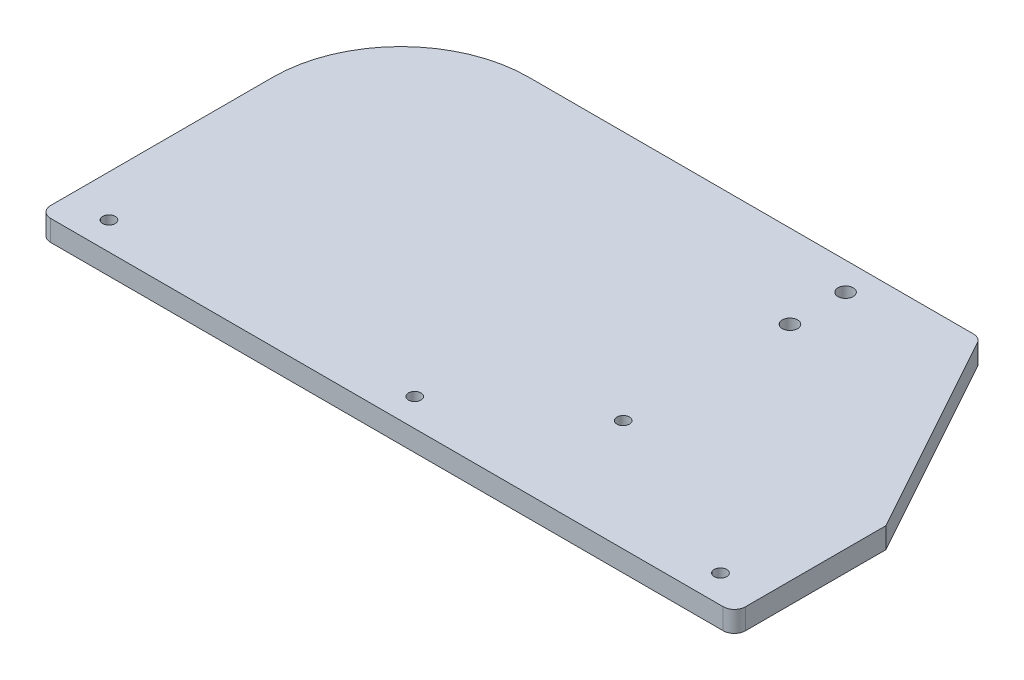
ISO-10303-21;
HEADER;
FILE_DESCRIPTION(('STEP AP214'),'2;1');
FILE_NAME('part.step','',(''),(''),'','','');
FILE_SCHEMA(('AUTOMOTIVE_DESIGN { 1 0 10303 214 1 1 1 1 }'));
ENDSEC;
DATA;
#1=APPLICATION_CONTEXT('core data for automotive mechanical design processes');
#2=APPLICATION_PROTOCOL_DEFINITION('international standard','automotive_design',2000,#1);
#3=PRODUCT_CONTEXT('',#1,'mechanical');
#4=PRODUCT('Part','Part','',(#3));
#5=PRODUCT_RELATED_PRODUCT_CATEGORY('part','',(#4));
#6=PRODUCT_DEFINITION_FORMATION('','',#4);
#7=PRODUCT_DEFINITION_CONTEXT('part definition',#1,'design');
#8=PRODUCT_DEFINITION('design','',#6,#7);
#9=PRODUCT_DEFINITION_SHAPE('','',#8);
#10=(LENGTH_UNIT() NAMED_UNIT(*) SI_UNIT(.MILLI.,.METRE.));
#11=(NAMED_UNIT(*) PLANE_ANGLE_UNIT() SI_UNIT($,.RADIAN.));
#12=(NAMED_UNIT(*) SI_UNIT($,.STERADIAN.) SOLID_ANGLE_UNIT());
#13=UNCERTAINTY_MEASURE_WITH_UNIT(LENGTH_MEASURE(1.E-05),#10,'distance_accuracy_value','');
#14=(GEOMETRIC_REPRESENTATION_CONTEXT(3) GLOBAL_UNCERTAINTY_ASSIGNED_CONTEXT((#13)) GLOBAL_UNIT_ASSIGNED_CONTEXT((#10,
#11,#12)) REPRESENTATION_CONTEXT('',''));
#15=CARTESIAN_POINT('',(0.,0.,0.));
#16=DIRECTION('',(0.,0.,1.));
#17=DIRECTION('',(1.,0.,0.));
#18=AXIS2_PLACEMENT_3D('',#15,#16,#17);
#19=CARTESIAN_POINT('',(-166.,7.5,6.));
#20=DIRECTION('',(0.,1.,0.));
#21=DIRECTION('',(0.,0.,1.));
#22=AXIS2_PLACEMENT_3D('',#19,#20,#21);
#23=PLANE('',#22);
#24=CARTESIAN_POINT('',(0.,7.5,-110.));
#25=DIRECTION('',(0.,1.,0.));
#26=DIRECTION('',(0.,0.,1.));
#27=AXIS2_PLACEMENT_3D('',#24,#25,#26);
#28=CIRCLE('',#27,2.75);
#29=CARTESIAN_POINT('',(0.,7.5,-107.25));
#30=VERTEX_POINT('',#29);
#31=EDGE_CURVE('E256',#30,#30,#28,.T.);
#32=ORIENTED_EDGE('',*,*,#31,.F.);
#33=EDGE_LOOP('',(#32));
#34=FACE_BOUND('',#33,.T.);
#35=CARTESIAN_POINT('',(-155.,7.5,0.));
#36=DIRECTION('',(0.,1.,0.));
#37=DIRECTION('',(0.,0.,1.));
#38=AXIS2_PLACEMENT_3D('',#35,#36,#37);
#39=CIRCLE('',#38,2.25000000000001);
#40=CARTESIAN_POINT('',(-155.,7.5,2.25000000000001));
#41=VERTEX_POINT('',#40);
#42=EDGE_CURVE('E240',#41,#41,#39,.T.);
#43=ORIENTED_EDGE('',*,*,#42,.F.);
#44=EDGE_LOOP('',(#43));
#45=FACE_BOUND('',#44,.T.);
#46=CARTESIAN_POINT('',(65.,7.5,0.));
#47=DIRECTION('',(0.,1.,0.));
#48=DIRECTION('',(0.,0.,1.));
#49=AXIS2_PLACEMENT_3D('',#46,#47,#48);
#50=CIRCLE('',#49,2.25000000000001);
#51=CARTESIAN_POINT('',(65.,7.5,2.25000000000001));
#52=VERTEX_POINT('',#51);
#53=EDGE_CURVE('E152',#52,#52,#50,.T.);
#54=ORIENTED_EDGE('',*,*,#53,.F.);
#55=EDGE_LOOP('',(#54));
#56=FACE_BOUND('',#55,.T.);
#57=CARTESIAN_POINT('',(-166.,7.5,6.));
#58=DIRECTION('',(0.,1.,0.));
#59=DIRECTION('',(0.,0.,1.));
#60=AXIS2_PLACEMENT_3D('',#57,#58,#59);
#61=CIRCLE('',#60,4.);
#62=CARTESIAN_POINT('',(-170.,7.5,6.));
#63=VERTEX_POINT('',#62);
#64=CARTESIAN_POINT('',(-166.,7.5,10.));
#65=VERTEX_POINT('',#64);
#66=EDGE_CURVE('E173',#63,#65,#61,.T.);
#67=ORIENTED_EDGE('',*,*,#66,.T.);
#68=DIRECTION('',(1.,0.,0.));
#69=VECTOR('',#68,1.);
#70=CARTESIAN_POINT('',(-166.,7.5,10.));
#71=LINE('',#70,#69);
#72=CARTESIAN_POINT('',(76.,7.5,10.));
#73=VERTEX_POINT('',#72);
#74=EDGE_CURVE('E103',#65,#73,#71,.T.);
#75=ORIENTED_EDGE('',*,*,#74,.T.);
#76=CARTESIAN_POINT('',(76.,7.5,6.));
#77=DIRECTION('',(0.,1.,0.));
#78=DIRECTION('',(0.,0.,1.));
#79=AXIS2_PLACEMENT_3D('',#76,#77,#78);
#80=CIRCLE('',#79,4.);
#81=CARTESIAN_POINT('',(80.,7.5,6.));
#82=VERTEX_POINT('',#81);
#83=EDGE_CURVE('E198',#73,#82,#80,.T.);
#84=ORIENTED_EDGE('',*,*,#83,.T.);
#85=DIRECTION('',(0.,0.,-1.));
#86=VECTOR('',#85,1.);
#87=CARTESIAN_POINT('',(80.,7.5,6.));
#88=LINE('',#87,#86);
#89=CARTESIAN_POINT('',(80.,7.5,-44.5));
#90=VERTEX_POINT('',#89);
#91=EDGE_CURVE('E216',#82,#90,#88,.T.);
#92=ORIENTED_EDGE('',*,*,#91,.T.);
#93=DIRECTION('',(-0.482924771234865,0.,-0.875661844165745));
#94=VECTOR('',#93,1.);
#95=CARTESIAN_POINT('',(80.,7.5,-44.5));
#96=LINE('',#95,#94);
#97=CARTESIAN_POINT('',(39.502647376663,7.5,-117.931699084939));
#98=VERTEX_POINT('',#97);
#99=EDGE_CURVE('E214',#90,#98,#96,.T.);
#100=ORIENTED_EDGE('',*,*,#99,.T.);
#101=CARTESIAN_POINT('',(36.,7.5,-116.));
#102=DIRECTION('',(0.,1.,0.));
#103=DIRECTION('',(0.,0.,1.));
#104=AXIS2_PLACEMENT_3D('',#101,#102,#103);
#105=CIRCLE('',#104,4.);
#106=CARTESIAN_POINT('',(36.,7.5,-120.));
#107=VERTEX_POINT('',#106);
#108=EDGE_CURVE('E125',#98,#107,#105,.T.);
#109=ORIENTED_EDGE('',*,*,#108,.T.);
#110=DIRECTION('',(-1.,0.,0.));
#111=VECTOR('',#110,1.);
#112=CARTESIAN_POINT('',(36.,7.5,-120.));
#113=LINE('',#112,#111);
#114=CARTESIAN_POINT('',(-124.,7.5,-120.));
#115=VERTEX_POINT('',#114);
#116=EDGE_CURVE('E119',#107,#115,#113,.T.);
#117=ORIENTED_EDGE('',*,*,#116,.T.);
#118=CARTESIAN_POINT('',(-124.,7.5,-74.));
#119=DIRECTION('',(0.,1.,0.));
#120=DIRECTION('',(0.,0.,1.));
#121=AXIS2_PLACEMENT_3D('',#118,#119,#120);
#122=CIRCLE('',#121,46.);
#123=CARTESIAN_POINT('',(-170.,7.5,-74.));
#124=VERTEX_POINT('',#123);
#125=EDGE_CURVE('E123',#115,#124,#122,.T.);
#126=ORIENTED_EDGE('',*,*,#125,.T.);
#127=DIRECTION('',(0.,0.,1.));
#128=VECTOR('',#127,1.);
#129=CARTESIAN_POINT('',(-170.,7.5,-74.));
#130=LINE('',#129,#128);
#131=EDGE_CURVE('E57',#124,#63,#130,.T.);
#132=ORIENTED_EDGE('',*,*,#131,.T.);
#133=EDGE_LOOP('',(#67,#75,#84,#92,#100,#109,#117,#126,#132));
#134=FACE_BOUND('',#133,.T.);
#135=CARTESIAN_POINT('',(-45.,7.5,0.));
#136=DIRECTION('',(0.,1.,0.));
#137=DIRECTION('',(0.,0.,1.));
#138=AXIS2_PLACEMENT_3D('',#135,#136,#137);
#139=CIRCLE('',#138,2.25);
#140=CARTESIAN_POINT('',(-45.,7.5,2.25));
#141=VERTEX_POINT('',#140);
#142=EDGE_CURVE('E232',#141,#141,#139,.T.);
#143=ORIENTED_EDGE('',*,*,#142,.F.);
#144=EDGE_LOOP('',(#143));
#145=FACE_BOUND('',#144,.T.);
#146=CARTESIAN_POINT('',(0.,7.5,-90.));
#147=DIRECTION('',(0.,1.,0.));
#148=DIRECTION('',(0.,0.,1.));
#149=AXIS2_PLACEMENT_3D('',#146,#147,#148);
#150=CIRCLE('',#149,2.75);
#151=CARTESIAN_POINT('',(0.,7.5,-87.25));
#152=VERTEX_POINT('',#151);
#153=EDGE_CURVE('E248',#152,#152,#150,.T.);
#154=ORIENTED_EDGE('',*,*,#153,.F.);
#155=EDGE_LOOP('',(#154));
#156=FACE_BOUND('',#155,.T.);
#157=CARTESIAN_POINT('',(0.,7.5,-30.));
#158=DIRECTION('',(0.,1.,0.));
#159=DIRECTION('',(0.,0.,1.));
#160=AXIS2_PLACEMENT_3D('',#157,#158,#159);
#161=CIRCLE('',#160,2.25);
#162=CARTESIAN_POINT('',(0.,7.5,-27.75));
#163=VERTEX_POINT('',#162);
#164=EDGE_CURVE('E264',#163,#163,#161,.T.);
#165=ORIENTED_EDGE('',*,*,#164,.F.);
#166=EDGE_LOOP('',(#165));
#167=FACE_BOUND('',#166,.T.);
#168=ADVANCED_FACE('F39',(#34,#45,#56,#134,#145,#156,#167),#23,.T.);
#169=CARTESIAN_POINT('',(-166.,0.,6.));
#170=DIRECTION('',(0.,1.,0.));
#171=DIRECTION('',(0.,0.,1.));
#172=AXIS2_PLACEMENT_3D('',#169,#170,#171);
#173=PLANE('',#172);
#174=CARTESIAN_POINT('',(-166.,0.,6.));
#175=DIRECTION('',(0.,1.,0.));
#176=DIRECTION('',(0.,0.,1.));
#177=AXIS2_PLACEMENT_3D('',#174,#175,#176);
#178=CIRCLE('',#177,4.);
#179=CARTESIAN_POINT('',(-170.,0.,6.));
#180=VERTEX_POINT('',#179);
#181=CARTESIAN_POINT('',(-166.,0.,10.));
#182=VERTEX_POINT('',#181);
#183=EDGE_CURVE('E147',#180,#182,#178,.T.);
#184=ORIENTED_EDGE('',*,*,#183,.F.);
#185=DIRECTION('',(0.,0.,1.));
#186=VECTOR('',#185,1.);
#187=CARTESIAN_POINT('',(-170.,0.,-74.));
#188=LINE('',#187,#186);
#189=CARTESIAN_POINT('',(-170.,0.,-74.));
#190=VERTEX_POINT('',#189);
#191=EDGE_CURVE('E95',#190,#180,#188,.T.);
#192=ORIENTED_EDGE('',*,*,#191,.F.);
#193=CARTESIAN_POINT('',(-124.,0.,-74.));
#194=DIRECTION('',(0.,1.,0.));
#195=DIRECTION('',(0.,0.,1.));
#196=AXIS2_PLACEMENT_3D('',#193,#194,#195);
#197=CIRCLE('',#196,46.);
#198=CARTESIAN_POINT('',(-124.,0.,-120.));
#199=VERTEX_POINT('',#198);
#200=EDGE_CURVE('E89',#199,#190,#197,.T.);
#201=ORIENTED_EDGE('',*,*,#200,.F.);
#202=DIRECTION('',(-1.,0.,0.));
#203=VECTOR('',#202,1.);
#204=CARTESIAN_POINT('',(36.,0.,-120.));
#205=LINE('',#204,#203);
#206=CARTESIAN_POINT('',(36.,0.,-120.));
#207=VERTEX_POINT('',#206);
#208=EDGE_CURVE('E134',#207,#199,#205,.T.);
#209=ORIENTED_EDGE('',*,*,#208,.F.);
#210=CARTESIAN_POINT('',(36.,0.,-116.));
#211=DIRECTION('',(0.,1.,0.));
#212=DIRECTION('',(0.,0.,1.));
#213=AXIS2_PLACEMENT_3D('',#210,#211,#212);
#214=CIRCLE('',#213,4.);
#215=CARTESIAN_POINT('',(39.502647376663,0.,-117.931699084939));
#216=VERTEX_POINT('',#215);
#217=EDGE_CURVE('E164',#216,#207,#214,.T.);
#218=ORIENTED_EDGE('',*,*,#217,.F.);
#219=DIRECTION('',(-0.482924771234865,0.,-0.875661844165745));
#220=VECTOR('',#219,1.);
#221=CARTESIAN_POINT('',(80.,0.,-44.5));
#222=LINE('',#221,#220);
#223=CARTESIAN_POINT('',(80.,0.,-44.5));
#224=VERTEX_POINT('',#223);
#225=EDGE_CURVE('E161',#224,#216,#222,.T.);
#226=ORIENTED_EDGE('',*,*,#225,.F.);
#227=DIRECTION('',(0.,0.,-1.));
#228=VECTOR('',#227,1.);
#229=CARTESIAN_POINT('',(80.,0.,6.));
#230=LINE('',#229,#228);
#231=CARTESIAN_POINT('',(80.,0.,6.));
#232=VERTEX_POINT('',#231);
#233=EDGE_CURVE('E158',#232,#224,#230,.T.);
#234=ORIENTED_EDGE('',*,*,#233,.F.);
#235=CARTESIAN_POINT('',(76.,0.,6.));
#236=DIRECTION('',(0.,1.,0.));
#237=DIRECTION('',(0.,0.,1.));
#238=AXIS2_PLACEMENT_3D('',#235,#236,#237);
#239=CIRCLE('',#238,4.);
#240=CARTESIAN_POINT('',(76.,0.,10.));
#241=VERTEX_POINT('',#240);
#242=EDGE_CURVE('E155',#241,#232,#239,.T.);
#243=ORIENTED_EDGE('',*,*,#242,.F.);
#244=DIRECTION('',(1.,0.,0.));
#245=VECTOR('',#244,1.);
#246=CARTESIAN_POINT('',(-166.,0.,10.));
#247=LINE('',#246,#245);
#248=EDGE_CURVE('E151',#182,#241,#247,.T.);
#249=ORIENTED_EDGE('',*,*,#248,.F.);
#250=EDGE_LOOP('',(#184,#192,#201,#209,#218,#226,#234,#243,#249));
#251=FACE_BOUND('',#250,.T.);
#252=CARTESIAN_POINT('',(65.,0.,0.));
#253=DIRECTION('',(0.,1.,0.));
#254=DIRECTION('',(0.,0.,1.));
#255=AXIS2_PLACEMENT_3D('',#252,#253,#254);
#256=CIRCLE('',#255,2.25000000000001);
#257=CARTESIAN_POINT('',(65.,0.,2.25000000000001));
#258=VERTEX_POINT('',#257);
#259=EDGE_CURVE('E228',#258,#258,#256,.T.);
#260=ORIENTED_EDGE('',*,*,#259,.T.);
#261=EDGE_LOOP('',(#260));
#262=FACE_BOUND('',#261,.T.);
#263=CARTESIAN_POINT('',(-45.,0.,0.));
#264=DIRECTION('',(0.,1.,0.));
#265=DIRECTION('',(0.,0.,1.));
#266=AXIS2_PLACEMENT_3D('',#263,#264,#265);
#267=CIRCLE('',#266,2.25);
#268=CARTESIAN_POINT('',(-45.,0.,2.25));
#269=VERTEX_POINT('',#268);
#270=EDGE_CURVE('E236',#269,#269,#267,.T.);
#271=ORIENTED_EDGE('',*,*,#270,.T.);
#272=EDGE_LOOP('',(#271));
#273=FACE_BOUND('',#272,.T.);
#274=CARTESIAN_POINT('',(-155.,0.,0.));
#275=DIRECTION('',(0.,1.,0.));
#276=DIRECTION('',(0.,0.,1.));
#277=AXIS2_PLACEMENT_3D('',#274,#275,#276);
#278=CIRCLE('',#277,2.25000000000001);
#279=CARTESIAN_POINT('',(-155.,0.,2.25000000000001));
#280=VERTEX_POINT('',#279);
#281=EDGE_CURVE('E244',#280,#280,#278,.T.);
#282=ORIENTED_EDGE('',*,*,#281,.T.);
#283=EDGE_LOOP('',(#282));
#284=FACE_BOUND('',#283,.T.);
#285=CARTESIAN_POINT('',(0.,0.,-90.));
#286=DIRECTION('',(0.,1.,0.));
#287=DIRECTION('',(0.,0.,1.));
#288=AXIS2_PLACEMENT_3D('',#285,#286,#287);
#289=CIRCLE('',#288,2.75);
#290=CARTESIAN_POINT('',(0.,0.,-87.25));
#291=VERTEX_POINT('',#290);
#292=EDGE_CURVE('E252',#291,#291,#289,.T.);
#293=ORIENTED_EDGE('',*,*,#292,.T.);
#294=EDGE_LOOP('',(#293));
#295=FACE_BOUND('',#294,.T.);
#296=CARTESIAN_POINT('',(0.,0.,-110.));
#297=DIRECTION('',(0.,1.,0.));
#298=DIRECTION('',(0.,0.,1.));
#299=AXIS2_PLACEMENT_3D('',#296,#297,#298);
#300=CIRCLE('',#299,2.75);
#301=CARTESIAN_POINT('',(0.,0.,-107.25));
#302=VERTEX_POINT('',#301);
#303=EDGE_CURVE('E260',#302,#302,#300,.T.);
#304=ORIENTED_EDGE('',*,*,#303,.T.);
#305=EDGE_LOOP('',(#304));
#306=FACE_BOUND('',#305,.T.);
#307=CARTESIAN_POINT('',(0.,0.,-30.));
#308=DIRECTION('',(0.,1.,0.));
#309=DIRECTION('',(0.,0.,1.));
#310=AXIS2_PLACEMENT_3D('',#307,#308,#309);
#311=CIRCLE('',#310,2.25);
#312=CARTESIAN_POINT('',(0.,0.,-27.75));
#313=VERTEX_POINT('',#312);
#314=EDGE_CURVE('E268',#313,#313,#311,.T.);
#315=ORIENTED_EDGE('',*,*,#314,.T.);
#316=EDGE_LOOP('',(#315));
#317=FACE_BOUND('',#316,.T.);
#318=ADVANCED_FACE('F202',(#251,#262,#273,#284,#295,#306,#317),#173,.F.);
#319=CARTESIAN_POINT('',(-166.,7.5,6.));
#320=DIRECTION('',(0.,-1.,0.));
#321=DIRECTION('',(0.,0.,-1.));
#322=AXIS2_PLACEMENT_3D('',#319,#320,#321);
#323=CYLINDRICAL_SURFACE('',#322,4.);
#324=ORIENTED_EDGE('',*,*,#183,.T.);
#325=DIRECTION('',(0.,-1.,0.));
#326=VECTOR('',#325,1.);
#327=CARTESIAN_POINT('',(-166.,7.5,10.));
#328=LINE('',#327,#326);
#329=EDGE_CURVE('E11',#65,#182,#328,.T.);
#330=ORIENTED_EDGE('',*,*,#329,.F.);
#331=ORIENTED_EDGE('',*,*,#66,.F.);
#332=DIRECTION('',(0.,-1.,0.));
#333=VECTOR('',#332,1.);
#334=CARTESIAN_POINT('',(-170.,7.5,6.));
#335=LINE('',#334,#333);
#336=EDGE_CURVE('E143',#63,#180,#335,.T.);
#337=ORIENTED_EDGE('',*,*,#336,.T.);
#338=EDGE_LOOP('',(#324,#330,#331,#337));
#339=FACE_BOUND('',#338,.T.);
#340=ADVANCED_FACE('F41',(#339),#323,.T.);
#341=CARTESIAN_POINT('',(-166.,7.5,10.));
#342=DIRECTION('',(0.,0.,-1.));
#343=DIRECTION('',(-1.,0.,0.));
#344=AXIS2_PLACEMENT_3D('',#341,#342,#343);
#345=PLANE('',#344);
#346=ORIENTED_EDGE('',*,*,#248,.T.);
#347=DIRECTION('',(0.,-1.,0.));
#348=VECTOR('',#347,1.);
#349=CARTESIAN_POINT('',(76.,7.5,10.));
#350=LINE('',#349,#348);
#351=EDGE_CURVE('E49',#73,#241,#350,.T.);
#352=ORIENTED_EDGE('',*,*,#351,.F.);
#353=ORIENTED_EDGE('',*,*,#74,.F.);
#354=ORIENTED_EDGE('',*,*,#329,.T.);
#355=EDGE_LOOP('',(#346,#352,#353,#354));
#356=FACE_BOUND('',#355,.T.);
#357=ADVANCED_FACE('F308',(#356),#345,.F.);
#358=CARTESIAN_POINT('',(76.,7.5,6.));
#359=DIRECTION('',(0.,-1.,0.));
#360=DIRECTION('',(0.,0.,-1.));
#361=AXIS2_PLACEMENT_3D('',#358,#359,#360);
#362=CYLINDRICAL_SURFACE('',#361,4.);
#363=ORIENTED_EDGE('',*,*,#242,.T.);
#364=DIRECTION('',(0.,-1.,0.));
#365=VECTOR('',#364,1.);
#366=CARTESIAN_POINT('',(80.,7.5,6.));
#367=LINE('',#366,#365);
#368=EDGE_CURVE('E188',#82,#232,#367,.T.);
#369=ORIENTED_EDGE('',*,*,#368,.F.);
#370=ORIENTED_EDGE('',*,*,#83,.F.);
#371=ORIENTED_EDGE('',*,*,#351,.T.);
#372=EDGE_LOOP('',(#363,#369,#370,#371));
#373=FACE_BOUND('',#372,.T.);
#374=ADVANCED_FACE('F196',(#373),#362,.T.);
#375=CARTESIAN_POINT('',(80.,7.5,6.));
#376=DIRECTION('',(-1.,0.,0.));
#377=DIRECTION('',(0.,0.,1.));
#378=AXIS2_PLACEMENT_3D('',#375,#376,#377);
#379=PLANE('',#378);
#380=ORIENTED_EDGE('',*,*,#233,.T.);
#381=DIRECTION('',(0.,-1.,0.));
#382=VECTOR('',#381,1.);
#383=CARTESIAN_POINT('',(80.,7.5,-44.5));
#384=LINE('',#383,#382);
#385=EDGE_CURVE('E184',#90,#224,#384,.T.);
#386=ORIENTED_EDGE('',*,*,#385,.F.);
#387=ORIENTED_EDGE('',*,*,#91,.F.);
#388=ORIENTED_EDGE('',*,*,#368,.T.);
#389=EDGE_LOOP('',(#380,#386,#387,#388));
#390=FACE_BOUND('',#389,.T.);
#391=ADVANCED_FACE('F208',(#390),#379,.F.);
#392=CARTESIAN_POINT('',(80.,7.5,-44.5));
#393=DIRECTION('',(-0.875661844165745,0.,0.482924771234864));
#394=DIRECTION('',(0.482924771234865,0.,0.875661844165745));
#395=AXIS2_PLACEMENT_3D('',#392,#393,#394);
#396=PLANE('',#395);
#397=ORIENTED_EDGE('',*,*,#225,.T.);
#398=DIRECTION('',(0.,-1.,0.));
#399=VECTOR('',#398,1.);
#400=CARTESIAN_POINT('',(39.502647376663,7.5,-117.931699084939));
#401=LINE('',#400,#399);
#402=EDGE_CURVE('E180',#98,#216,#401,.T.);
#403=ORIENTED_EDGE('',*,*,#402,.F.);
#404=ORIENTED_EDGE('',*,*,#99,.F.);
#405=ORIENTED_EDGE('',*,*,#385,.T.);
#406=EDGE_LOOP('',(#397,#403,#404,#405));
#407=FACE_BOUND('',#406,.T.);
#408=ADVANCED_FACE('F212',(#407),#396,.F.);
#409=CARTESIAN_POINT('',(36.,7.5,-116.));
#410=DIRECTION('',(0.,-1.,0.));
#411=DIRECTION('',(0.,0.,-1.));
#412=AXIS2_PLACEMENT_3D('',#409,#410,#411);
#413=CYLINDRICAL_SURFACE('',#412,4.);
#414=ORIENTED_EDGE('',*,*,#217,.T.);
#415=DIRECTION('',(0.,-1.,0.));
#416=VECTOR('',#415,1.);
#417=CARTESIAN_POINT('',(36.,7.5,-120.));
#418=LINE('',#417,#416);
#419=EDGE_CURVE('E136',#107,#207,#418,.T.);
#420=ORIENTED_EDGE('',*,*,#419,.F.);
#421=ORIENTED_EDGE('',*,*,#108,.F.);
#422=ORIENTED_EDGE('',*,*,#402,.T.);
#423=EDGE_LOOP('',(#414,#420,#421,#422));
#424=FACE_BOUND('',#423,.T.);
#425=ADVANCED_FACE('F299',(#424),#413,.T.);
#426=CARTESIAN_POINT('',(36.,7.5,-120.));
#427=DIRECTION('',(0.,0.,1.));
#428=DIRECTION('',(1.,0.,0.));
#429=AXIS2_PLACEMENT_3D('',#426,#427,#428);
#430=PLANE('',#429);
#431=ORIENTED_EDGE('',*,*,#208,.T.);
#432=DIRECTION('',(0.,-1.,0.));
#433=VECTOR('',#432,1.);
#434=CARTESIAN_POINT('',(-124.,7.5,-120.));
#435=LINE('',#434,#433);
#436=EDGE_CURVE('E131',#115,#199,#435,.T.);
#437=ORIENTED_EDGE('',*,*,#436,.F.);
#438=ORIENTED_EDGE('',*,*,#116,.F.);
#439=ORIENTED_EDGE('',*,*,#419,.T.);
#440=EDGE_LOOP('',(#431,#437,#438,#439));
#441=FACE_BOUND('',#440,.T.);
#442=ADVANCED_FACE('F132',(#441),#430,.F.);
#443=CARTESIAN_POINT('',(-124.,7.5,-74.));
#444=DIRECTION('',(0.,-1.,0.));
#445=DIRECTION('',(0.,0.,-1.));
#446=AXIS2_PLACEMENT_3D('',#443,#444,#445);
#447=CYLINDRICAL_SURFACE('',#446,46.);
#448=ORIENTED_EDGE('',*,*,#200,.T.);
#449=DIRECTION('',(0.,-1.,0.));
#450=VECTOR('',#449,1.);
#451=CARTESIAN_POINT('',(-170.,7.5,-74.));
#452=LINE('',#451,#450);
#453=EDGE_CURVE('E137',#124,#190,#452,.T.);
#454=ORIENTED_EDGE('',*,*,#453,.F.);
#455=ORIENTED_EDGE('',*,*,#125,.F.);
#456=ORIENTED_EDGE('',*,*,#436,.T.);
#457=EDGE_LOOP('',(#448,#454,#455,#456));
#458=FACE_BOUND('',#457,.T.);
#459=ADVANCED_FACE('F139',(#458),#447,.T.);
#460=CARTESIAN_POINT('',(-170.,7.5,-74.));
#461=DIRECTION('',(1.,0.,0.));
#462=DIRECTION('',(0.,0.,-1.));
#463=AXIS2_PLACEMENT_3D('',#460,#461,#462);
#464=PLANE('',#463);
#465=ORIENTED_EDGE('',*,*,#191,.T.);
#466=ORIENTED_EDGE('',*,*,#336,.F.);
#467=ORIENTED_EDGE('',*,*,#131,.F.);
#468=ORIENTED_EDGE('',*,*,#453,.T.);
#469=EDGE_LOOP('',(#465,#466,#467,#468));
#470=FACE_BOUND('',#469,.T.);
#471=ADVANCED_FACE('F292',(#470),#464,.F.);
#472=CARTESIAN_POINT('',(65.,7.5,0.));
#473=DIRECTION('',(0.,-1.,0.));
#474=DIRECTION('',(0.,0.,-1.));
#475=AXIS2_PLACEMENT_3D('',#472,#473,#474);
#476=CYLINDRICAL_SURFACE('',#475,2.25000000000001);
#477=ORIENTED_EDGE('',*,*,#53,.T.);
#478=EDGE_LOOP('',(#477));
#479=FACE_BOUND('',#478,.T.);
#480=ORIENTED_EDGE('',*,*,#259,.F.);
#481=EDGE_LOOP('',(#480));
#482=FACE_BOUND('',#481,.T.);
#483=ADVANCED_FACE('F289',(#479,#482),#476,.F.);
#484=CARTESIAN_POINT('',(-45.,7.5,0.));
#485=DIRECTION('',(0.,-1.,0.));
#486=DIRECTION('',(0.,0.,-1.));
#487=AXIS2_PLACEMENT_3D('',#484,#485,#486);
#488=CYLINDRICAL_SURFACE('',#487,2.25);
#489=ORIENTED_EDGE('',*,*,#142,.T.);
#490=EDGE_LOOP('',(#489));
#491=FACE_BOUND('',#490,.T.);
#492=ORIENTED_EDGE('',*,*,#270,.F.);
#493=EDGE_LOOP('',(#492));
#494=FACE_BOUND('',#493,.T.);
#495=ADVANCED_FACE('F377',(#491,#494),#488,.F.);
#496=CARTESIAN_POINT('',(-155.,7.5,0.));
#497=DIRECTION('',(0.,-1.,0.));
#498=DIRECTION('',(0.,0.,-1.));
#499=AXIS2_PLACEMENT_3D('',#496,#497,#498);
#500=CYLINDRICAL_SURFACE('',#499,2.25000000000001);
#501=ORIENTED_EDGE('',*,*,#42,.T.);
#502=EDGE_LOOP('',(#501));
#503=FACE_BOUND('',#502,.T.);
#504=ORIENTED_EDGE('',*,*,#281,.F.);
#505=EDGE_LOOP('',(#504));
#506=FACE_BOUND('',#505,.T.);
#507=ADVANCED_FACE('F385',(#503,#506),#500,.F.);
#508=CARTESIAN_POINT('',(0.,7.5,-90.));
#509=DIRECTION('',(0.,-1.,0.));
#510=DIRECTION('',(0.,0.,-1.));
#511=AXIS2_PLACEMENT_3D('',#508,#509,#510);
#512=CYLINDRICAL_SURFACE('',#511,2.75);
#513=ORIENTED_EDGE('',*,*,#153,.T.);
#514=EDGE_LOOP('',(#513));
#515=FACE_BOUND('',#514,.T.);
#516=ORIENTED_EDGE('',*,*,#292,.F.);
#517=EDGE_LOOP('',(#516));
#518=FACE_BOUND('',#517,.T.);
#519=ADVANCED_FACE('F393',(#515,#518),#512,.F.);
#520=CARTESIAN_POINT('',(0.,7.5,-110.));
#521=DIRECTION('',(0.,-1.,0.));
#522=DIRECTION('',(0.,0.,-1.));
#523=AXIS2_PLACEMENT_3D('',#520,#521,#522);
#524=CYLINDRICAL_SURFACE('',#523,2.75);
#525=ORIENTED_EDGE('',*,*,#31,.T.);
#526=EDGE_LOOP('',(#525));
#527=FACE_BOUND('',#526,.T.);
#528=ORIENTED_EDGE('',*,*,#303,.F.);
#529=EDGE_LOOP('',(#528));
#530=FACE_BOUND('',#529,.T.);
#531=ADVANCED_FACE('F402',(#527,#530),#524,.F.);
#532=CARTESIAN_POINT('',(0.,7.5,-30.));
#533=DIRECTION('',(0.,-1.,0.));
#534=DIRECTION('',(0.,0.,-1.));
#535=AXIS2_PLACEMENT_3D('',#532,#533,#534);
#536=CYLINDRICAL_SURFACE('',#535,2.25);
#537=ORIENTED_EDGE('',*,*,#164,.T.);
#538=EDGE_LOOP('',(#537));
#539=FACE_BOUND('',#538,.T.);
#540=ORIENTED_EDGE('',*,*,#314,.F.);
#541=EDGE_LOOP('',(#540));
#542=FACE_BOUND('',#541,.T.);
#543=ADVANCED_FACE('F276',(#539,#542),#536,.F.);
#544=CLOSED_SHELL('',(#168,#318,#340,#357,#374,#391,#408,#425,#442,#459,#471,#483,#495,#507,
#519,#531,#543));
#545=MANIFOLD_SOLID_BREP('B2',#544);
#546=ADVANCED_BREP_SHAPE_REPRESENTATION('',(#18,#545),#14);
#547=SHAPE_DEFINITION_REPRESENTATION(#9,#546);
ENDSEC;
END-ISO-10303-21;
